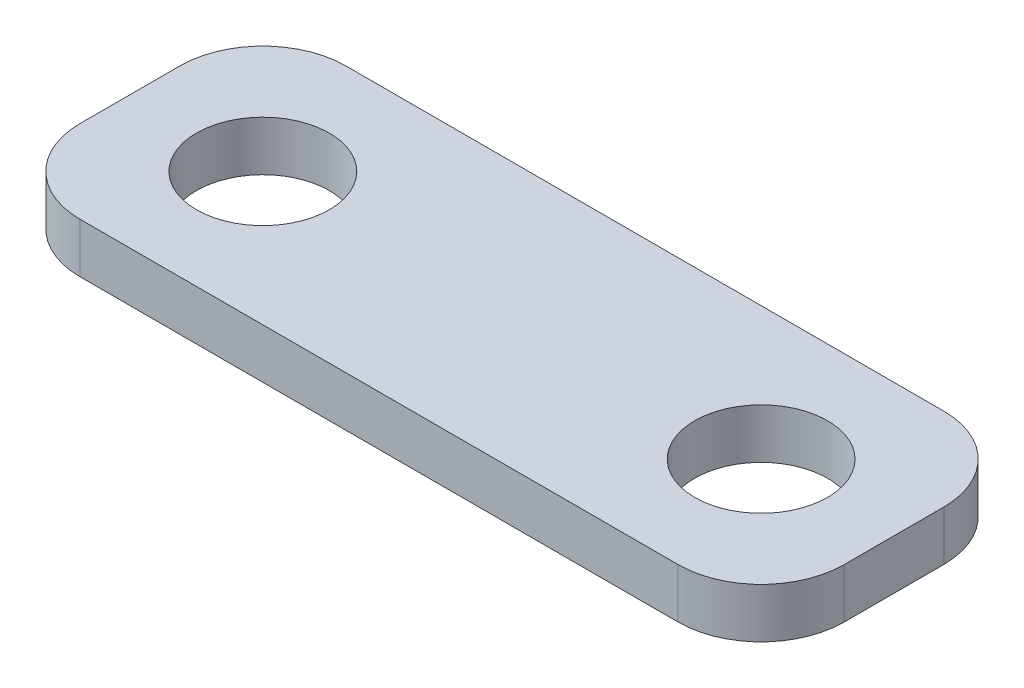
ISO-10303-21;
HEADER;
FILE_DESCRIPTION(('STEP AP214'),'2;1');
FILE_NAME('part.step','',(''),(''),'','','');
FILE_SCHEMA(('AUTOMOTIVE_DESIGN { 1 0 10303 214 1 1 1 1 }'));
ENDSEC;
DATA;
#1=APPLICATION_CONTEXT('core data for automotive mechanical design processes');
#2=APPLICATION_PROTOCOL_DEFINITION('international standard','automotive_design',2000,#1);
#3=PRODUCT_CONTEXT('',#1,'mechanical');
#4=PRODUCT('Part','Part','',(#3));
#5=PRODUCT_RELATED_PRODUCT_CATEGORY('part','',(#4));
#6=PRODUCT_DEFINITION_FORMATION('','',#4);
#7=PRODUCT_DEFINITION_CONTEXT('part definition',#1,'design');
#8=PRODUCT_DEFINITION('design','',#6,#7);
#9=PRODUCT_DEFINITION_SHAPE('','',#8);
#10=(LENGTH_UNIT() NAMED_UNIT(*) SI_UNIT(.MILLI.,.METRE.));
#11=(NAMED_UNIT(*) PLANE_ANGLE_UNIT() SI_UNIT($,.RADIAN.));
#12=(NAMED_UNIT(*) SI_UNIT($,.STERADIAN.) SOLID_ANGLE_UNIT());
#13=UNCERTAINTY_MEASURE_WITH_UNIT(LENGTH_MEASURE(1.E-05),#10,'distance_accuracy_value','');
#14=(GEOMETRIC_REPRESENTATION_CONTEXT(3) GLOBAL_UNCERTAINTY_ASSIGNED_CONTEXT((#13)) GLOBAL_UNIT_ASSIGNED_CONTEXT((#10,
#11,#12)) REPRESENTATION_CONTEXT('',''));
#15=CARTESIAN_POINT('',(0.,0.,0.));
#16=DIRECTION('',(0.,0.,1.));
#17=DIRECTION('',(1.,0.,0.));
#18=AXIS2_PLACEMENT_3D('',#15,#16,#17);
#19=CARTESIAN_POINT('',(0.,3.,0.));
#20=DIRECTION('',(0.,1.,0.));
#21=DIRECTION('',(0.,0.,1.));
#22=AXIS2_PLACEMENT_3D('',#19,#20,#21);
#23=PLANE('',#22);
#24=CARTESIAN_POINT('',(-15.,3.,0.));
#25=DIRECTION('',(0.,1.,0.));
#26=DIRECTION('',(0.,0.,1.));
#27=AXIS2_PLACEMENT_3D('',#24,#25,#26);
#28=CIRCLE('',#27,4.);
#29=CARTESIAN_POINT('',(-15.,3.,4.));
#30=VERTEX_POINT('',#29);
#31=EDGE_CURVE('E163',#30,#30,#28,.T.);
#32=ORIENTED_EDGE('',*,*,#31,.F.);
#33=EDGE_LOOP('',(#32));
#34=FACE_BOUND('',#33,.T.);
#35=DIRECTION('',(0.,0.,1.));
#36=VECTOR('',#35,1.);
#37=CARTESIAN_POINT('',(-23.,3.,-8.));
#38=LINE('',#37,#36);
#39=CARTESIAN_POINT('',(-23.,3.,-3.));
#40=VERTEX_POINT('',#39);
#41=CARTESIAN_POINT('',(-23.,3.,3.));
#42=VERTEX_POINT('',#41);
#43=EDGE_CURVE('E170',#40,#42,#38,.T.);
#44=ORIENTED_EDGE('',*,*,#43,.T.);
#45=CARTESIAN_POINT('',(-18.,3.,3.));
#46=DIRECTION('',(0.,1.,0.));
#47=DIRECTION('',(0.,0.,1.));
#48=AXIS2_PLACEMENT_3D('',#45,#46,#47);
#49=CIRCLE('',#48,5.);
#50=CARTESIAN_POINT('',(-18.,3.,8.));
#51=VERTEX_POINT('',#50);
#52=EDGE_CURVE('E147',#42,#51,#49,.T.);
#53=ORIENTED_EDGE('',*,*,#52,.T.);
#54=DIRECTION('',(1.,0.,0.));
#55=VECTOR('',#54,1.);
#56=CARTESIAN_POINT('',(-23.,3.,8.));
#57=LINE('',#56,#55);
#58=CARTESIAN_POINT('',(18.,3.,8.));
#59=VERTEX_POINT('',#58);
#60=EDGE_CURVE('E118',#51,#59,#57,.T.);
#61=ORIENTED_EDGE('',*,*,#60,.T.);
#62=CARTESIAN_POINT('',(18.,3.,3.));
#63=DIRECTION('',(0.,1.,0.));
#64=DIRECTION('',(0.,0.,1.));
#65=AXIS2_PLACEMENT_3D('',#62,#63,#64);
#66=CIRCLE('',#65,5.);
#67=CARTESIAN_POINT('',(23.,3.,3.));
#68=VERTEX_POINT('',#67);
#69=EDGE_CURVE('E142',#59,#68,#66,.T.);
#70=ORIENTED_EDGE('',*,*,#69,.T.);
#71=DIRECTION('',(0.,0.,-1.));
#72=VECTOR('',#71,1.);
#73=CARTESIAN_POINT('',(23.,3.,-8.));
#74=LINE('',#73,#72);
#75=CARTESIAN_POINT('',(23.,3.,-3.));
#76=VERTEX_POINT('',#75);
#77=EDGE_CURVE('E125',#68,#76,#74,.T.);
#78=ORIENTED_EDGE('',*,*,#77,.T.);
#79=CARTESIAN_POINT('',(18.,3.,-3.));
#80=DIRECTION('',(0.,1.,0.));
#81=DIRECTION('',(0.,0.,1.));
#82=AXIS2_PLACEMENT_3D('',#79,#80,#81);
#83=CIRCLE('',#82,5.);
#84=CARTESIAN_POINT('',(18.,3.,-8.));
#85=VERTEX_POINT('',#84);
#86=EDGE_CURVE('E54',#76,#85,#83,.T.);
#87=ORIENTED_EDGE('',*,*,#86,.T.);
#88=DIRECTION('',(-1.,0.,0.));
#89=VECTOR('',#88,1.);
#90=CARTESIAN_POINT('',(-23.,3.,-8.));
#91=LINE('',#90,#89);
#92=CARTESIAN_POINT('',(-18.,3.,-8.));
#93=VERTEX_POINT('',#92);
#94=EDGE_CURVE('E128',#85,#93,#91,.T.);
#95=ORIENTED_EDGE('',*,*,#94,.T.);
#96=CARTESIAN_POINT('',(-18.,3.,-3.));
#97=DIRECTION('',(0.,1.,0.));
#98=DIRECTION('',(0.,0.,1.));
#99=AXIS2_PLACEMENT_3D('',#96,#97,#98);
#100=CIRCLE('',#99,5.);
#101=EDGE_CURVE('E145',#93,#40,#100,.T.);
#102=ORIENTED_EDGE('',*,*,#101,.T.);
#103=EDGE_LOOP('',(#44,#53,#61,#70,#78,#87,#95,#102));
#104=FACE_BOUND('',#103,.T.);
#105=CARTESIAN_POINT('',(15.,3.,0.));
#106=DIRECTION('',(0.,1.,0.));
#107=DIRECTION('',(0.,0.,1.));
#108=AXIS2_PLACEMENT_3D('',#105,#106,#107);
#109=CIRCLE('',#108,4.);
#110=CARTESIAN_POINT('',(15.,3.,4.));
#111=VERTEX_POINT('',#110);
#112=EDGE_CURVE('E175',#111,#111,#109,.T.);
#113=ORIENTED_EDGE('',*,*,#112,.F.);
#114=EDGE_LOOP('',(#113));
#115=FACE_BOUND('',#114,.T.);
#116=ADVANCED_FACE('F32',(#34,#104,#115),#23,.T.);
#117=CARTESIAN_POINT('',(0.,0.,0.));
#118=DIRECTION('',(0.,1.,0.));
#119=DIRECTION('',(0.,0.,1.));
#120=AXIS2_PLACEMENT_3D('',#117,#118,#119);
#121=PLANE('',#120);
#122=DIRECTION('',(1.,0.,0.));
#123=VECTOR('',#122,1.);
#124=CARTESIAN_POINT('',(-23.,0.,8.));
#125=LINE('',#124,#123);
#126=CARTESIAN_POINT('',(-18.,0.,8.));
#127=VERTEX_POINT('',#126);
#128=CARTESIAN_POINT('',(18.,0.,8.));
#129=VERTEX_POINT('',#128);
#130=EDGE_CURVE('E115',#127,#129,#125,.T.);
#131=ORIENTED_EDGE('',*,*,#130,.F.);
#132=CARTESIAN_POINT('',(-18.,0.,3.));
#133=DIRECTION('',(0.,1.,0.));
#134=DIRECTION('',(0.,0.,1.));
#135=AXIS2_PLACEMENT_3D('',#132,#133,#134);
#136=CIRCLE('',#135,5.);
#137=CARTESIAN_POINT('',(-23.,0.,3.));
#138=VERTEX_POINT('',#137);
#139=EDGE_CURVE('E98',#127,#138,#136,.F.);
#140=ORIENTED_EDGE('',*,*,#139,.T.);
#141=DIRECTION('',(0.,0.,1.));
#142=VECTOR('',#141,1.);
#143=CARTESIAN_POINT('',(-23.,0.,-8.));
#144=LINE('',#143,#142);
#145=CARTESIAN_POINT('',(-23.,0.,-3.));
#146=VERTEX_POINT('',#145);
#147=EDGE_CURVE('E126',#146,#138,#144,.T.);
#148=ORIENTED_EDGE('',*,*,#147,.F.);
#149=CARTESIAN_POINT('',(-18.,0.,-3.));
#150=DIRECTION('',(0.,1.,0.));
#151=DIRECTION('',(0.,0.,1.));
#152=AXIS2_PLACEMENT_3D('',#149,#150,#151);
#153=CIRCLE('',#152,5.);
#154=CARTESIAN_POINT('',(-18.,0.,-8.));
#155=VERTEX_POINT('',#154);
#156=EDGE_CURVE('E109',#146,#155,#153,.F.);
#157=ORIENTED_EDGE('',*,*,#156,.T.);
#158=DIRECTION('',(-1.,0.,0.));
#159=VECTOR('',#158,1.);
#160=CARTESIAN_POINT('',(-23.,0.,-8.));
#161=LINE('',#160,#159);
#162=CARTESIAN_POINT('',(18.,0.,-8.));
#163=VERTEX_POINT('',#162);
#164=EDGE_CURVE('E130',#163,#155,#161,.T.);
#165=ORIENTED_EDGE('',*,*,#164,.F.);
#166=CARTESIAN_POINT('',(18.,0.,-3.));
#167=DIRECTION('',(0.,1.,0.));
#168=DIRECTION('',(0.,0.,1.));
#169=AXIS2_PLACEMENT_3D('',#166,#167,#168);
#170=CIRCLE('',#169,5.);
#171=CARTESIAN_POINT('',(23.,0.,-3.));
#172=VERTEX_POINT('',#171);
#173=EDGE_CURVE('E136',#163,#172,#170,.F.);
#174=ORIENTED_EDGE('',*,*,#173,.T.);
#175=DIRECTION('',(0.,0.,-1.));
#176=VECTOR('',#175,1.);
#177=CARTESIAN_POINT('',(23.,0.,-8.));
#178=LINE('',#177,#176);
#179=CARTESIAN_POINT('',(23.,0.,3.));
#180=VERTEX_POINT('',#179);
#181=EDGE_CURVE('E158',#180,#172,#178,.T.);
#182=ORIENTED_EDGE('',*,*,#181,.F.);
#183=CARTESIAN_POINT('',(18.,0.,3.));
#184=DIRECTION('',(0.,1.,0.));
#185=DIRECTION('',(0.,0.,1.));
#186=AXIS2_PLACEMENT_3D('',#183,#184,#185);
#187=CIRCLE('',#186,5.);
#188=EDGE_CURVE('E119',#180,#129,#187,.F.);
#189=ORIENTED_EDGE('',*,*,#188,.T.);
#190=EDGE_LOOP('',(#131,#140,#148,#157,#165,#174,#182,#189));
#191=FACE_BOUND('',#190,.T.);
#192=CARTESIAN_POINT('',(-15.,0.,0.));
#193=DIRECTION('',(0.,1.,0.));
#194=DIRECTION('',(0.,0.,1.));
#195=AXIS2_PLACEMENT_3D('',#192,#193,#194);
#196=CIRCLE('',#195,4.);
#197=CARTESIAN_POINT('',(-15.,0.,4.));
#198=VERTEX_POINT('',#197);
#199=EDGE_CURVE('E166',#198,#198,#196,.T.);
#200=ORIENTED_EDGE('',*,*,#199,.T.);
#201=EDGE_LOOP('',(#200));
#202=FACE_BOUND('',#201,.T.);
#203=CARTESIAN_POINT('',(15.,0.,0.));
#204=DIRECTION('',(0.,1.,0.));
#205=DIRECTION('',(0.,0.,1.));
#206=AXIS2_PLACEMENT_3D('',#203,#204,#205);
#207=CIRCLE('',#206,4.);
#208=CARTESIAN_POINT('',(15.,0.,4.));
#209=VERTEX_POINT('',#208);
#210=EDGE_CURVE('E177',#209,#209,#207,.T.);
#211=ORIENTED_EDGE('',*,*,#210,.T.);
#212=EDGE_LOOP('',(#211));
#213=FACE_BOUND('',#212,.T.);
#214=ADVANCED_FACE('F122',(#191,#202,#213),#121,.F.);
#215=CARTESIAN_POINT('',(23.,3.,-8.));
#216=DIRECTION('',(-1.,0.,0.));
#217=DIRECTION('',(0.,0.,1.));
#218=AXIS2_PLACEMENT_3D('',#215,#216,#217);
#219=PLANE('',#218);
#220=ORIENTED_EDGE('',*,*,#181,.T.);
#221=DIRECTION('',(0.,-1.,0.));
#222=VECTOR('',#221,1.);
#223=CARTESIAN_POINT('',(23.,3.,-3.));
#224=LINE('',#223,#222);
#225=EDGE_CURVE('E11',#172,#76,#224,.F.);
#226=ORIENTED_EDGE('',*,*,#225,.T.);
#227=ORIENTED_EDGE('',*,*,#77,.F.);
#228=DIRECTION('',(0.,-1.,0.));
#229=VECTOR('',#228,1.);
#230=CARTESIAN_POINT('',(23.,3.,3.));
#231=LINE('',#230,#229);
#232=EDGE_CURVE('E40',#68,#180,#231,.T.);
#233=ORIENTED_EDGE('',*,*,#232,.T.);
#234=EDGE_LOOP('',(#220,#226,#227,#233));
#235=FACE_BOUND('',#234,.T.);
#236=ADVANCED_FACE('F157',(#235),#219,.F.);
#237=CARTESIAN_POINT('',(-23.,3.,-8.));
#238=DIRECTION('',(0.,0.,1.));
#239=DIRECTION('',(1.,0.,0.));
#240=AXIS2_PLACEMENT_3D('',#237,#238,#239);
#241=PLANE('',#240);
#242=ORIENTED_EDGE('',*,*,#164,.T.);
#243=DIRECTION('',(0.,-1.,0.));
#244=VECTOR('',#243,1.);
#245=CARTESIAN_POINT('',(-18.,3.,-8.));
#246=LINE('',#245,#244);
#247=EDGE_CURVE('E47',#155,#93,#246,.F.);
#248=ORIENTED_EDGE('',*,*,#247,.T.);
#249=ORIENTED_EDGE('',*,*,#94,.F.);
#250=DIRECTION('',(0.,-1.,0.));
#251=VECTOR('',#250,1.);
#252=CARTESIAN_POINT('',(18.,3.,-8.));
#253=LINE('',#252,#251);
#254=EDGE_CURVE('E149',#85,#163,#253,.T.);
#255=ORIENTED_EDGE('',*,*,#254,.T.);
#256=EDGE_LOOP('',(#242,#248,#249,#255));
#257=FACE_BOUND('',#256,.T.);
#258=ADVANCED_FACE('F203',(#257),#241,.F.);
#259=CARTESIAN_POINT('',(-23.,3.,-8.));
#260=DIRECTION('',(1.,0.,0.));
#261=DIRECTION('',(0.,0.,-1.));
#262=AXIS2_PLACEMENT_3D('',#259,#260,#261);
#263=PLANE('',#262);
#264=ORIENTED_EDGE('',*,*,#147,.T.);
#265=DIRECTION('',(0.,-1.,0.));
#266=VECTOR('',#265,1.);
#267=CARTESIAN_POINT('',(-23.,3.,3.));
#268=LINE('',#267,#266);
#269=EDGE_CURVE('E103',#138,#42,#268,.F.);
#270=ORIENTED_EDGE('',*,*,#269,.T.);
#271=ORIENTED_EDGE('',*,*,#43,.F.);
#272=DIRECTION('',(0.,-1.,0.));
#273=VECTOR('',#272,1.);
#274=CARTESIAN_POINT('',(-23.,3.,-3.));
#275=LINE('',#274,#273);
#276=EDGE_CURVE('E108',#40,#146,#275,.T.);
#277=ORIENTED_EDGE('',*,*,#276,.T.);
#278=EDGE_LOOP('',(#264,#270,#271,#277));
#279=FACE_BOUND('',#278,.T.);
#280=ADVANCED_FACE('F200',(#279),#263,.F.);
#281=CARTESIAN_POINT('',(-23.,3.,8.));
#282=DIRECTION('',(0.,0.,-1.));
#283=DIRECTION('',(-1.,0.,0.));
#284=AXIS2_PLACEMENT_3D('',#281,#282,#283);
#285=PLANE('',#284);
#286=ORIENTED_EDGE('',*,*,#60,.F.);
#287=DIRECTION('',(0.,-1.,0.));
#288=VECTOR('',#287,1.);
#289=CARTESIAN_POINT('',(-18.,3.,8.));
#290=LINE('',#289,#288);
#291=EDGE_CURVE('E102',#51,#127,#290,.T.);
#292=ORIENTED_EDGE('',*,*,#291,.T.);
#293=ORIENTED_EDGE('',*,*,#130,.T.);
#294=DIRECTION('',(0.,-1.,0.));
#295=VECTOR('',#294,1.);
#296=CARTESIAN_POINT('',(18.,3.,8.));
#297=LINE('',#296,#295);
#298=EDGE_CURVE('E120',#129,#59,#297,.F.);
#299=ORIENTED_EDGE('',*,*,#298,.T.);
#300=EDGE_LOOP('',(#286,#292,#293,#299));
#301=FACE_BOUND('',#300,.T.);
#302=ADVANCED_FACE('F114',(#301),#285,.F.);
#303=CARTESIAN_POINT('',(-15.,3.,0.));
#304=DIRECTION('',(0.,-1.,0.));
#305=DIRECTION('',(0.,0.,-1.));
#306=AXIS2_PLACEMENT_3D('',#303,#304,#305);
#307=CYLINDRICAL_SURFACE('',#306,4.);
#308=ORIENTED_EDGE('',*,*,#31,.T.);
#309=EDGE_LOOP('',(#308));
#310=FACE_BOUND('',#309,.T.);
#311=ORIENTED_EDGE('',*,*,#199,.F.);
#312=EDGE_LOOP('',(#311));
#313=FACE_BOUND('',#312,.T.);
#314=ADVANCED_FACE('F195',(#310,#313),#307,.F.);
#315=CARTESIAN_POINT('',(15.,3.,0.));
#316=DIRECTION('',(0.,-1.,0.));
#317=DIRECTION('',(0.,0.,-1.));
#318=AXIS2_PLACEMENT_3D('',#315,#316,#317);
#319=CYLINDRICAL_SURFACE('',#318,4.);
#320=ORIENTED_EDGE('',*,*,#112,.T.);
#321=EDGE_LOOP('',(#320));
#322=FACE_BOUND('',#321,.T.);
#323=ORIENTED_EDGE('',*,*,#210,.F.);
#324=EDGE_LOOP('',(#323));
#325=FACE_BOUND('',#324,.T.);
#326=ADVANCED_FACE('F183',(#322,#325),#319,.F.);
#327=CARTESIAN_POINT('',(-18.,3.,3.));
#328=DIRECTION('',(0.,-1.,0.));
#329=DIRECTION('',(0.,0.,-1.));
#330=AXIS2_PLACEMENT_3D('',#327,#328,#329);
#331=CYLINDRICAL_SURFACE('',#330,5.);
#332=ORIENTED_EDGE('',*,*,#52,.F.);
#333=ORIENTED_EDGE('',*,*,#269,.F.);
#334=ORIENTED_EDGE('',*,*,#139,.F.);
#335=ORIENTED_EDGE('',*,*,#291,.F.);
#336=EDGE_LOOP('',(#332,#333,#334,#335));
#337=FACE_BOUND('',#336,.T.);
#338=ADVANCED_FACE('F101',(#337),#331,.T.);
#339=CARTESIAN_POINT('',(-18.,3.,-3.));
#340=DIRECTION('',(0.,-1.,0.));
#341=DIRECTION('',(0.,0.,-1.));
#342=AXIS2_PLACEMENT_3D('',#339,#340,#341);
#343=CYLINDRICAL_SURFACE('',#342,5.);
#344=ORIENTED_EDGE('',*,*,#101,.F.);
#345=ORIENTED_EDGE('',*,*,#247,.F.);
#346=ORIENTED_EDGE('',*,*,#156,.F.);
#347=ORIENTED_EDGE('',*,*,#276,.F.);
#348=EDGE_LOOP('',(#344,#345,#346,#347));
#349=FACE_BOUND('',#348,.T.);
#350=ADVANCED_FACE('F211',(#349),#343,.T.);
#351=CARTESIAN_POINT('',(18.,3.,-3.));
#352=DIRECTION('',(0.,-1.,0.));
#353=DIRECTION('',(0.,0.,-1.));
#354=AXIS2_PLACEMENT_3D('',#351,#352,#353);
#355=CYLINDRICAL_SURFACE('',#354,5.);
#356=ORIENTED_EDGE('',*,*,#86,.F.);
#357=ORIENTED_EDGE('',*,*,#225,.F.);
#358=ORIENTED_EDGE('',*,*,#173,.F.);
#359=ORIENTED_EDGE('',*,*,#254,.F.);
#360=EDGE_LOOP('',(#356,#357,#358,#359));
#361=FACE_BOUND('',#360,.T.);
#362=ADVANCED_FACE('F213',(#361),#355,.T.);
#363=CARTESIAN_POINT('',(18.,3.,3.));
#364=DIRECTION('',(0.,-1.,0.));
#365=DIRECTION('',(0.,0.,-1.));
#366=AXIS2_PLACEMENT_3D('',#363,#364,#365);
#367=CYLINDRICAL_SURFACE('',#366,5.);
#368=ORIENTED_EDGE('',*,*,#69,.F.);
#369=ORIENTED_EDGE('',*,*,#298,.F.);
#370=ORIENTED_EDGE('',*,*,#188,.F.);
#371=ORIENTED_EDGE('',*,*,#232,.F.);
#372=EDGE_LOOP('',(#368,#369,#370,#371));
#373=FACE_BOUND('',#372,.T.);
#374=ADVANCED_FACE('F34',(#373),#367,.T.);
#375=CLOSED_SHELL('',(#116,#214,#236,#258,#280,#302,#314,#326,#338,#350,#362,#374));
#376=MANIFOLD_SOLID_BREP('B2',#375);
#377=ADVANCED_BREP_SHAPE_REPRESENTATION('',(#18,#376),#14);
#378=SHAPE_DEFINITION_REPRESENTATION(#9,#377);
ENDSEC;
END-ISO-10303-21;
